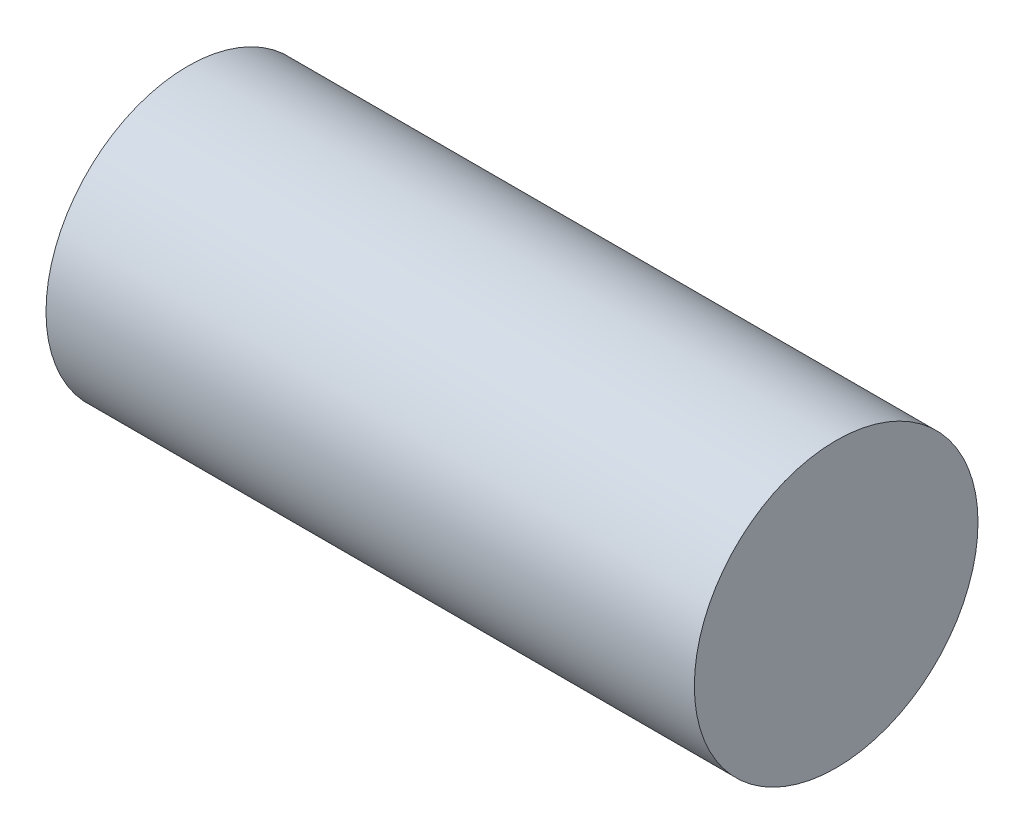
ISO-10303-21;
HEADER;
FILE_DESCRIPTION(('STEP AP214'),'2;1');
FILE_NAME('part.step','',(''),(''),'','','');
FILE_SCHEMA(('AUTOMOTIVE_DESIGN { 1 0 10303 214 1 1 1 1 }'));
ENDSEC;
DATA;
#1=APPLICATION_CONTEXT('core data for automotive mechanical design processes');
#2=APPLICATION_PROTOCOL_DEFINITION('international standard','automotive_design',2000,#1);
#3=PRODUCT_CONTEXT('',#1,'mechanical');
#4=PRODUCT('Part','Part','',(#3));
#5=PRODUCT_RELATED_PRODUCT_CATEGORY('part','',(#4));
#6=PRODUCT_DEFINITION_FORMATION('','',#4);
#7=PRODUCT_DEFINITION_CONTEXT('part definition',#1,'design');
#8=PRODUCT_DEFINITION('design','',#6,#7);
#9=PRODUCT_DEFINITION_SHAPE('','',#8);
#10=(LENGTH_UNIT() NAMED_UNIT(*) SI_UNIT(.MILLI.,.METRE.));
#11=(NAMED_UNIT(*) PLANE_ANGLE_UNIT() SI_UNIT($,.RADIAN.));
#12=(NAMED_UNIT(*) SI_UNIT($,.STERADIAN.) SOLID_ANGLE_UNIT());
#13=UNCERTAINTY_MEASURE_WITH_UNIT(LENGTH_MEASURE(1.E-05),#10,'distance_accuracy_value','');
#14=(GEOMETRIC_REPRESENTATION_CONTEXT(3) GLOBAL_UNCERTAINTY_ASSIGNED_CONTEXT((#13)) GLOBAL_UNIT_ASSIGNED_CONTEXT((#10,
#11,#12)) REPRESENTATION_CONTEXT('',''));
#15=CARTESIAN_POINT('',(0.,0.,0.));
#16=DIRECTION('',(0.,0.,1.));
#17=DIRECTION('',(1.,0.,0.));
#18=AXIS2_PLACEMENT_3D('',#15,#16,#17);
#19=CARTESIAN_POINT('',(-68.3820258794237,27.6716734995507,-48.4768478534986));
#20=DIRECTION('',(1.,0.,0.));
#21=DIRECTION('',(0.,1.,0.));
#22=AXIS2_PLACEMENT_3D('',#19,#20,#21);
#23=CYLINDRICAL_SURFACE('',#22,1.75);
#24=CARTESIAN_POINT('',(-68.3820258794237,27.6716734995507,-48.4768478534986));
#25=DIRECTION('',(-1.,0.,0.));
#26=DIRECTION('',(0.,-1.,0.));
#27=AXIS2_PLACEMENT_3D('',#24,#25,#26);
#28=CIRCLE('',#27,1.75);
#29=CARTESIAN_POINT('',(-68.3820258794237,25.9216734995507,-48.4768478534986));
#30=VERTEX_POINT('',#29);
#31=EDGE_CURVE('E10',#30,#30,#28,.T.);
#32=ORIENTED_EDGE('',*,*,#31,.F.);
#33=EDGE_LOOP('',(#32));
#34=FACE_BOUND('',#33,.T.);
#35=CARTESIAN_POINT('',(-60.3820258794237,27.6716734995507,-48.4768478534986));
#36=DIRECTION('',(-1.,0.,0.));
#37=DIRECTION('',(0.,-1.,0.));
#38=AXIS2_PLACEMENT_3D('',#35,#36,#37);
#39=CIRCLE('',#38,1.75);
#40=CARTESIAN_POINT('',(-60.3820258794237,25.9216734995507,-48.4768478534986));
#41=VERTEX_POINT('',#40);
#42=EDGE_CURVE('E40',#41,#41,#39,.T.);
#43=ORIENTED_EDGE('',*,*,#42,.T.);
#44=EDGE_LOOP('',(#43));
#45=FACE_BOUND('',#44,.T.);
#46=ADVANCED_FACE('F37',(#34,#45),#23,.T.);
#47=CARTESIAN_POINT('',(-68.3820258794237,27.6716734995507,-48.4768478534986));
#48=DIRECTION('',(-1.,0.,0.));
#49=DIRECTION('',(0.,-1.,0.));
#50=AXIS2_PLACEMENT_3D('',#47,#48,#49);
#51=PLANE('',#50);
#52=ORIENTED_EDGE('',*,*,#31,.T.);
#53=EDGE_LOOP('',(#52));
#54=FACE_BOUND('',#53,.T.);
#55=ADVANCED_FACE('F52',(#54),#51,.T.);
#56=CARTESIAN_POINT('',(-60.3820258794237,27.6716734995507,-48.4768478534986));
#57=DIRECTION('',(-1.,0.,0.));
#58=DIRECTION('',(0.,-1.,0.));
#59=AXIS2_PLACEMENT_3D('',#56,#57,#58);
#60=PLANE('',#59);
#61=ORIENTED_EDGE('',*,*,#42,.F.);
#62=EDGE_LOOP('',(#61));
#63=FACE_BOUND('',#62,.T.);
#64=ADVANCED_FACE('F50',(#63),#60,.F.);
#65=CLOSED_SHELL('',(#46,#55,#64));
#66=MANIFOLD_SOLID_BREP('B2',#65);
#67=ADVANCED_BREP_SHAPE_REPRESENTATION('',(#18,#66),#14);
#68=SHAPE_DEFINITION_REPRESENTATION(#9,#67);
ENDSEC;
END-ISO-10303-21;
